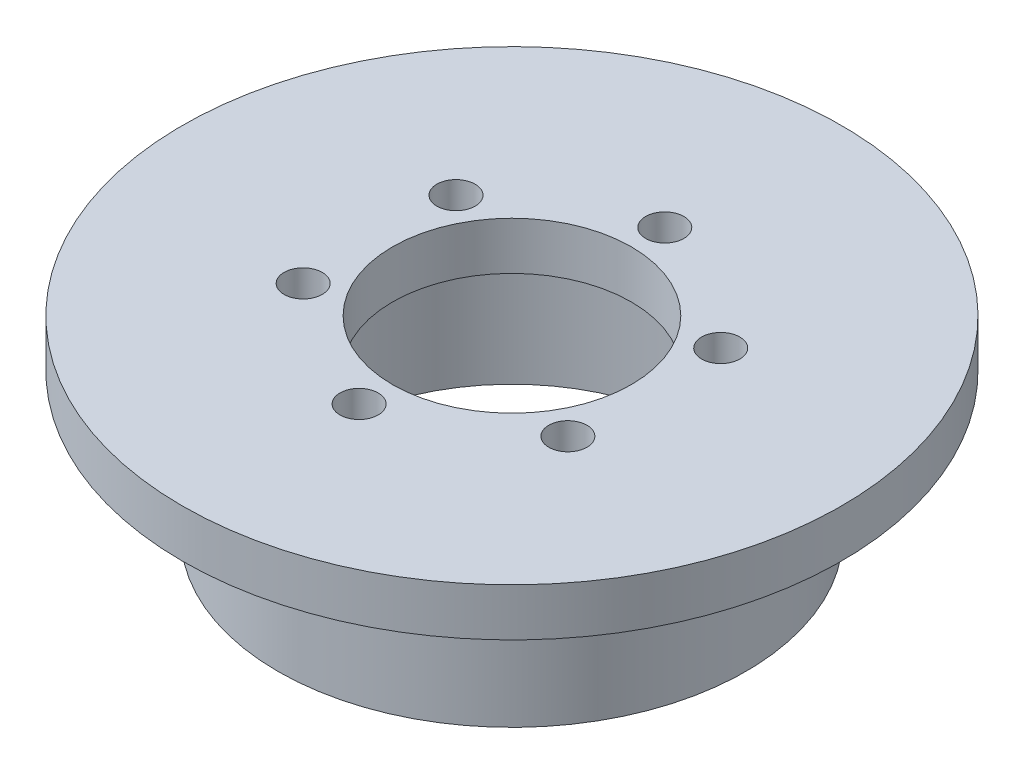
ISO-10303-21;
HEADER;
FILE_DESCRIPTION(('STEP AP214'),'2;1');
FILE_NAME('part.step','',(''),(''),'','','');
FILE_SCHEMA(('AUTOMOTIVE_DESIGN { 1 0 10303 214 1 1 1 1 }'));
ENDSEC;
DATA;
#1=APPLICATION_CONTEXT('core data for automotive mechanical design processes');
#2=APPLICATION_PROTOCOL_DEFINITION('international standard','automotive_design',2000,#1);
#3=PRODUCT_CONTEXT('',#1,'mechanical');
#4=PRODUCT('Part','Part','',(#3));
#5=PRODUCT_RELATED_PRODUCT_CATEGORY('part','',(#4));
#6=PRODUCT_DEFINITION_FORMATION('','',#4);
#7=PRODUCT_DEFINITION_CONTEXT('part definition',#1,'design');
#8=PRODUCT_DEFINITION('design','',#6,#7);
#9=PRODUCT_DEFINITION_SHAPE('','',#8);
#10=(LENGTH_UNIT() NAMED_UNIT(*) SI_UNIT(.MILLI.,.METRE.));
#11=(NAMED_UNIT(*) PLANE_ANGLE_UNIT() SI_UNIT($,.RADIAN.));
#12=(NAMED_UNIT(*) SI_UNIT($,.STERADIAN.) SOLID_ANGLE_UNIT());
#13=UNCERTAINTY_MEASURE_WITH_UNIT(LENGTH_MEASURE(1.E-05),#10,'distance_accuracy_value','');
#14=(GEOMETRIC_REPRESENTATION_CONTEXT(3) GLOBAL_UNCERTAINTY_ASSIGNED_CONTEXT((#13)) GLOBAL_UNIT_ASSIGNED_CONTEXT((#10,
#11,#12)) REPRESENTATION_CONTEXT('',''));
#15=CARTESIAN_POINT('',(0.,0.,0.));
#16=DIRECTION('',(0.,0.,1.));
#17=DIRECTION('',(1.,0.,0.));
#18=AXIS2_PLACEMENT_3D('',#15,#16,#17);
#19=CARTESIAN_POINT('',(0.,5.,0.));
#20=DIRECTION('',(0.,-1.,0.));
#21=DIRECTION('',(0.,0.,-1.));
#22=AXIS2_PLACEMENT_3D('',#19,#20,#21);
#23=CYLINDRICAL_SURFACE('',#22,34.5);
#24=CARTESIAN_POINT('',(0.,5.,0.));
#25=DIRECTION('',(0.,1.,0.));
#26=DIRECTION('',(0.,0.,1.));
#27=AXIS2_PLACEMENT_3D('',#24,#25,#26);
#28=CIRCLE('',#27,34.5);
#29=CARTESIAN_POINT('',(0.,5.,34.5));
#30=VERTEX_POINT('',#29);
#31=EDGE_CURVE('E40',#30,#30,#28,.T.);
#32=ORIENTED_EDGE('',*,*,#31,.F.);
#33=EDGE_LOOP('',(#32));
#34=FACE_BOUND('',#33,.T.);
#35=CARTESIAN_POINT('',(0.,0.,0.));
#36=DIRECTION('',(0.,1.,0.));
#37=DIRECTION('',(0.,0.,1.));
#38=AXIS2_PLACEMENT_3D('',#35,#36,#37);
#39=CIRCLE('',#38,34.5);
#40=CARTESIAN_POINT('',(0.,0.,34.5));
#41=VERTEX_POINT('',#40);
#42=EDGE_CURVE('E44',#41,#41,#39,.T.);
#43=ORIENTED_EDGE('',*,*,#42,.T.);
#44=EDGE_LOOP('',(#43));
#45=FACE_BOUND('',#44,.T.);
#46=ADVANCED_FACE('F34',(#34,#45),#23,.T.);
#47=CARTESIAN_POINT('',(0.,5.,0.));
#48=DIRECTION('',(0.,1.,0.));
#49=DIRECTION('',(0.,0.,1.));
#50=AXIS2_PLACEMENT_3D('',#47,#48,#49);
#51=PLANE('',#50);
#52=CARTESIAN_POINT('',(13.8564064605509,5.,-8.00000000000016));
#53=DIRECTION('',(0.,-1.,0.));
#54=DIRECTION('',(0.866025403784433,0.,-0.50000000000001));
#55=AXIS2_PLACEMENT_3D('',#52,#53,#54);
#56=CIRCLE('',#55,2.);
#57=CARTESIAN_POINT('',(15.5884572681198,5.,-9.00000000000018));
#58=VERTEX_POINT('',#57);
#59=EDGE_CURVE('E81',#58,#58,#56,.T.);
#60=ORIENTED_EDGE('',*,*,#59,.T.);
#61=EDGE_LOOP('',(#60));
#62=FACE_BOUND('',#61,.T.);
#63=CARTESIAN_POINT('',(13.8564064605511,5.,7.99999999999987));
#64=DIRECTION('',(0.,-1.,0.));
#65=DIRECTION('',(0.866025403784443,0.,0.499999999999992));
#66=AXIS2_PLACEMENT_3D('',#63,#64,#65);
#67=CIRCLE('',#66,2.);
#68=CARTESIAN_POINT('',(15.58845726812,5.,8.99999999999986));
#69=VERTEX_POINT('',#68);
#70=EDGE_CURVE('E87',#69,#69,#67,.T.);
#71=ORIENTED_EDGE('',*,*,#70,.T.);
#72=EDGE_LOOP('',(#71));
#73=FACE_BOUND('',#72,.T.);
#74=CARTESIAN_POINT('',(0.,5.,16.));
#75=DIRECTION('',(0.,-1.,0.));
#76=DIRECTION('',(0.,0.,1.));
#77=AXIS2_PLACEMENT_3D('',#74,#75,#76);
#78=CIRCLE('',#77,2.);
#79=CARTESIAN_POINT('',(0.,5.,18.));
#80=VERTEX_POINT('',#79);
#81=EDGE_CURVE('E93',#80,#80,#78,.T.);
#82=ORIENTED_EDGE('',*,*,#81,.T.);
#83=EDGE_LOOP('',(#82));
#84=FACE_BOUND('',#83,.T.);
#85=CARTESIAN_POINT('',(-13.856406460551,5.,8.00000000000007));
#86=DIRECTION('',(0.,-1.,0.));
#87=DIRECTION('',(-0.866025403784436,0.,0.500000000000004));
#88=AXIS2_PLACEMENT_3D('',#85,#86,#87);
#89=CIRCLE('',#88,2.);
#90=CARTESIAN_POINT('',(-15.5884572681199,5.,9.00000000000007));
#91=VERTEX_POINT('',#90);
#92=EDGE_CURVE('E75',#91,#91,#89,.T.);
#93=ORIENTED_EDGE('',*,*,#92,.T.);
#94=EDGE_LOOP('',(#93));
#95=FACE_BOUND('',#94,.T.);
#96=CARTESIAN_POINT('',(-13.856406460551,5.,-7.99999999999997));
#97=DIRECTION('',(0.,-1.,0.));
#98=DIRECTION('',(-0.86602540378444,0.,-0.499999999999998));
#99=AXIS2_PLACEMENT_3D('',#96,#97,#98);
#100=CIRCLE('',#99,2.);
#101=CARTESIAN_POINT('',(-15.5884572681199,5.,-8.99999999999996));
#102=VERTEX_POINT('',#101);
#103=EDGE_CURVE('E69',#102,#102,#100,.T.);
#104=ORIENTED_EDGE('',*,*,#103,.T.);
#105=EDGE_LOOP('',(#104));
#106=FACE_BOUND('',#105,.T.);
#107=CARTESIAN_POINT('',(0.,5.,-16.));
#108=DIRECTION('',(0.,-1.,0.));
#109=DIRECTION('',(0.,0.,-1.));
#110=AXIS2_PLACEMENT_3D('',#107,#108,#109);
#111=CIRCLE('',#110,2.);
#112=CARTESIAN_POINT('',(0.,5.,-18.));
#113=VERTEX_POINT('',#112);
#114=EDGE_CURVE('E63',#113,#113,#111,.T.);
#115=ORIENTED_EDGE('',*,*,#114,.T.);
#116=EDGE_LOOP('',(#115));
#117=FACE_BOUND('',#116,.T.);
#118=CARTESIAN_POINT('',(0.,5.,0.));
#119=DIRECTION('',(0.,-1.,0.));
#120=DIRECTION('',(0.,0.,-1.));
#121=AXIS2_PLACEMENT_3D('',#118,#119,#120);
#122=CIRCLE('',#121,12.5);
#123=CARTESIAN_POINT('',(0.,5.,-12.5));
#124=VERTEX_POINT('',#123);
#125=EDGE_CURVE('E57',#124,#124,#122,.T.);
#126=ORIENTED_EDGE('',*,*,#125,.T.);
#127=EDGE_LOOP('',(#126));
#128=FACE_BOUND('',#127,.T.);
#129=ORIENTED_EDGE('',*,*,#31,.T.);
#130=EDGE_LOOP('',(#129));
#131=FACE_BOUND('',#130,.T.);
#132=ADVANCED_FACE('F102',(#62,#73,#84,#95,#106,#117,#128,#131),#51,.T.);
#133=CARTESIAN_POINT('',(0.,0.,0.));
#134=DIRECTION('',(0.,1.,0.));
#135=DIRECTION('',(0.,0.,1.));
#136=AXIS2_PLACEMENT_3D('',#133,#134,#135);
#137=PLANE('',#136);
#138=CARTESIAN_POINT('',(0.,0.,0.));
#139=DIRECTION('',(0.,1.,0.));
#140=DIRECTION('',(0.,0.,1.));
#141=AXIS2_PLACEMENT_3D('',#138,#139,#140);
#142=CIRCLE('',#141,24.5);
#143=CARTESIAN_POINT('',(0.,0.,24.5));
#144=VERTEX_POINT('',#143);
#145=EDGE_CURVE('E10',#144,#144,#142,.F.);
#146=ORIENTED_EDGE('',*,*,#145,.F.);
#147=EDGE_LOOP('',(#146));
#148=FACE_BOUND('',#147,.T.);
#149=ORIENTED_EDGE('',*,*,#42,.F.);
#150=EDGE_LOOP('',(#149));
#151=FACE_BOUND('',#150,.T.);
#152=ADVANCED_FACE('F119',(#148,#151),#137,.F.);
#153=CARTESIAN_POINT('',(0.,-15.,0.));
#154=DIRECTION('',(0.,-1.,0.));
#155=DIRECTION('',(0.,0.,-1.));
#156=AXIS2_PLACEMENT_3D('',#153,#154,#155);
#157=PLANE('',#156);
#158=CARTESIAN_POINT('',(0.,-15.,0.));
#159=DIRECTION('',(0.,-1.,0.));
#160=DIRECTION('',(0.,0.,-1.));
#161=AXIS2_PLACEMENT_3D('',#158,#159,#160);
#162=CIRCLE('',#161,24.5);
#163=CARTESIAN_POINT('',(0.,-15.,-24.5));
#164=VERTEX_POINT('',#163);
#165=EDGE_CURVE('E49',#164,#164,#162,.T.);
#166=ORIENTED_EDGE('',*,*,#165,.T.);
#167=EDGE_LOOP('',(#166));
#168=FACE_BOUND('',#167,.T.);
#169=CARTESIAN_POINT('',(0.,-15.,0.));
#170=DIRECTION('',(0.,-1.,0.));
#171=DIRECTION('',(0.,0.,-1.));
#172=AXIS2_PLACEMENT_3D('',#169,#170,#171);
#173=CIRCLE('',#172,19.5);
#174=CARTESIAN_POINT('',(0.,-15.,-19.5));
#175=VERTEX_POINT('',#174);
#176=EDGE_CURVE('E53',#175,#175,#173,.T.);
#177=ORIENTED_EDGE('',*,*,#176,.F.);
#178=EDGE_LOOP('',(#177));
#179=FACE_BOUND('',#178,.T.);
#180=ADVANCED_FACE('F135',(#168,#179),#157,.T.);
#181=CARTESIAN_POINT('',(0.,-15.,0.));
#182=DIRECTION('',(0.,1.,0.));
#183=DIRECTION('',(0.,0.,1.));
#184=AXIS2_PLACEMENT_3D('',#181,#182,#183);
#185=CYLINDRICAL_SURFACE('',#184,24.5);
#186=ORIENTED_EDGE('',*,*,#165,.F.);
#187=EDGE_LOOP('',(#186));
#188=FACE_BOUND('',#187,.T.);
#189=ORIENTED_EDGE('',*,*,#145,.T.);
#190=EDGE_LOOP('',(#189));
#191=FACE_BOUND('',#190,.T.);
#192=ADVANCED_FACE('F129',(#188,#191),#185,.T.);
#193=CARTESIAN_POINT('',(0.,-15.,0.));
#194=DIRECTION('',(0.,1.,0.));
#195=DIRECTION('',(0.,0.,1.));
#196=AXIS2_PLACEMENT_3D('',#193,#194,#195);
#197=CYLINDRICAL_SURFACE('',#196,19.5);
#198=ORIENTED_EDGE('',*,*,#176,.T.);
#199=EDGE_LOOP('',(#198));
#200=FACE_BOUND('',#199,.T.);
#201=CARTESIAN_POINT('',(0.,0.,0.));
#202=DIRECTION('',(0.,-1.,0.));
#203=DIRECTION('',(0.,0.,-1.));
#204=AXIS2_PLACEMENT_3D('',#201,#202,#203);
#205=CIRCLE('',#204,19.5);
#206=CARTESIAN_POINT('',(0.,0.,-19.5));
#207=VERTEX_POINT('',#206);
#208=EDGE_CURVE('E54',#207,#207,#205,.T.);
#209=ORIENTED_EDGE('',*,*,#208,.F.);
#210=EDGE_LOOP('',(#209));
#211=FACE_BOUND('',#210,.T.);
#212=ADVANCED_FACE('F117',(#200,#211),#197,.F.);
#213=CARTESIAN_POINT('',(13.8564064605509,0.,-8.00000000000016));
#214=DIRECTION('',(0.,-1.,0.));
#215=DIRECTION('',(0.866025403784433,0.,-0.50000000000001));
#216=AXIS2_PLACEMENT_3D('',#213,#214,#215);
#217=CIRCLE('',#216,2.);
#218=CARTESIAN_POINT('',(15.5884572681198,0.,-9.00000000000018));
#219=VERTEX_POINT('',#218);
#220=EDGE_CURVE('E78',#219,#219,#217,.T.);
#221=ORIENTED_EDGE('',*,*,#220,.F.);
#222=EDGE_LOOP('',(#221));
#223=FACE_BOUND('',#222,.T.);
#224=CARTESIAN_POINT('',(13.8564064605511,0.,7.99999999999987));
#225=DIRECTION('',(0.,-1.,0.));
#226=DIRECTION('',(0.866025403784443,0.,0.499999999999992));
#227=AXIS2_PLACEMENT_3D('',#224,#225,#226);
#228=CIRCLE('',#227,2.);
#229=CARTESIAN_POINT('',(15.58845726812,0.,8.99999999999986));
#230=VERTEX_POINT('',#229);
#231=EDGE_CURVE('E84',#230,#230,#228,.T.);
#232=ORIENTED_EDGE('',*,*,#231,.F.);
#233=EDGE_LOOP('',(#232));
#234=FACE_BOUND('',#233,.T.);
#235=CARTESIAN_POINT('',(0.,0.,16.));
#236=DIRECTION('',(0.,-1.,0.));
#237=DIRECTION('',(0.,0.,1.));
#238=AXIS2_PLACEMENT_3D('',#235,#236,#237);
#239=CIRCLE('',#238,2.);
#240=CARTESIAN_POINT('',(0.,0.,18.));
#241=VERTEX_POINT('',#240);
#242=EDGE_CURVE('E90',#241,#241,#239,.T.);
#243=ORIENTED_EDGE('',*,*,#242,.F.);
#244=EDGE_LOOP('',(#243));
#245=FACE_BOUND('',#244,.T.);
#246=CARTESIAN_POINT('',(-13.856406460551,0.,8.00000000000007));
#247=DIRECTION('',(0.,-1.,0.));
#248=DIRECTION('',(-0.866025403784436,0.,0.500000000000004));
#249=AXIS2_PLACEMENT_3D('',#246,#247,#248);
#250=CIRCLE('',#249,2.);
#251=CARTESIAN_POINT('',(-15.5884572681199,0.,9.00000000000007));
#252=VERTEX_POINT('',#251);
#253=EDGE_CURVE('E96',#252,#252,#250,.T.);
#254=ORIENTED_EDGE('',*,*,#253,.F.);
#255=EDGE_LOOP('',(#254));
#256=FACE_BOUND('',#255,.T.);
#257=CARTESIAN_POINT('',(-13.856406460551,0.,-7.99999999999997));
#258=DIRECTION('',(0.,-1.,0.));
#259=DIRECTION('',(-0.86602540378444,0.,-0.499999999999998));
#260=AXIS2_PLACEMENT_3D('',#257,#258,#259);
#261=CIRCLE('',#260,2.);
#262=CARTESIAN_POINT('',(-15.5884572681199,0.,-8.99999999999996));
#263=VERTEX_POINT('',#262);
#264=EDGE_CURVE('E72',#263,#263,#261,.T.);
#265=ORIENTED_EDGE('',*,*,#264,.F.);
#266=EDGE_LOOP('',(#265));
#267=FACE_BOUND('',#266,.T.);
#268=CARTESIAN_POINT('',(0.,0.,-16.));
#269=DIRECTION('',(0.,-1.,0.));
#270=DIRECTION('',(0.,0.,-1.));
#271=AXIS2_PLACEMENT_3D('',#268,#269,#270);
#272=CIRCLE('',#271,2.);
#273=CARTESIAN_POINT('',(0.,0.,-18.));
#274=VERTEX_POINT('',#273);
#275=EDGE_CURVE('E66',#274,#274,#272,.T.);
#276=ORIENTED_EDGE('',*,*,#275,.F.);
#277=EDGE_LOOP('',(#276));
#278=FACE_BOUND('',#277,.T.);
#279=CARTESIAN_POINT('',(0.,0.,0.));
#280=DIRECTION('',(0.,-1.,0.));
#281=DIRECTION('',(0.,0.,-1.));
#282=AXIS2_PLACEMENT_3D('',#279,#280,#281);
#283=CIRCLE('',#282,12.5);
#284=CARTESIAN_POINT('',(0.,0.,-12.5));
#285=VERTEX_POINT('',#284);
#286=EDGE_CURVE('E60',#285,#285,#283,.T.);
#287=ORIENTED_EDGE('',*,*,#286,.F.);
#288=EDGE_LOOP('',(#287));
#289=FACE_BOUND('',#288,.T.);
#290=ORIENTED_EDGE('',*,*,#208,.T.);
#291=EDGE_LOOP('',(#290));
#292=FACE_BOUND('',#291,.T.);
#293=ADVANCED_FACE('F113',(#223,#234,#245,#256,#267,#278,#289,#292),#137,.F.);
#294=CARTESIAN_POINT('',(0.,5.,0.));
#295=DIRECTION('',(0.,-1.,0.));
#296=DIRECTION('',(0.,0.,-1.));
#297=AXIS2_PLACEMENT_3D('',#294,#295,#296);
#298=CYLINDRICAL_SURFACE('',#297,12.5);
#299=ORIENTED_EDGE('',*,*,#125,.F.);
#300=EDGE_LOOP('',(#299));
#301=FACE_BOUND('',#300,.T.);
#302=ORIENTED_EDGE('',*,*,#286,.T.);
#303=EDGE_LOOP('',(#302));
#304=FACE_BOUND('',#303,.T.);
#305=ADVANCED_FACE('F116',(#301,#304),#298,.F.);
#306=CARTESIAN_POINT('',(0.,5.,-16.));
#307=DIRECTION('',(0.,-1.,0.));
#308=DIRECTION('',(0.,0.,-1.));
#309=AXIS2_PLACEMENT_3D('',#306,#307,#308);
#310=CYLINDRICAL_SURFACE('',#309,2.);
#311=ORIENTED_EDGE('',*,*,#114,.F.);
#312=EDGE_LOOP('',(#311));
#313=FACE_BOUND('',#312,.T.);
#314=ORIENTED_EDGE('',*,*,#275,.T.);
#315=EDGE_LOOP('',(#314));
#316=FACE_BOUND('',#315,.T.);
#317=ADVANCED_FACE('F180',(#313,#316),#310,.F.);
#318=CARTESIAN_POINT('',(-13.856406460551,5.,-7.99999999999997));
#319=DIRECTION('',(0.,-1.,0.));
#320=DIRECTION('',(0.,0.,-1.));
#321=AXIS2_PLACEMENT_3D('',#318,#319,#320);
#322=CYLINDRICAL_SURFACE('',#321,2.);
#323=ORIENTED_EDGE('',*,*,#103,.F.);
#324=EDGE_LOOP('',(#323));
#325=FACE_BOUND('',#324,.T.);
#326=ORIENTED_EDGE('',*,*,#264,.T.);
#327=EDGE_LOOP('',(#326));
#328=FACE_BOUND('',#327,.T.);
#329=ADVANCED_FACE('F109',(#325,#328),#322,.F.);
#330=CARTESIAN_POINT('',(-13.856406460551,5.,8.00000000000007));
#331=DIRECTION('',(0.,-1.,0.));
#332=DIRECTION('',(0.,0.,-1.));
#333=AXIS2_PLACEMENT_3D('',#330,#331,#332);
#334=CYLINDRICAL_SURFACE('',#333,2.);
#335=ORIENTED_EDGE('',*,*,#92,.F.);
#336=EDGE_LOOP('',(#335));
#337=FACE_BOUND('',#336,.T.);
#338=ORIENTED_EDGE('',*,*,#253,.T.);
#339=EDGE_LOOP('',(#338));
#340=FACE_BOUND('',#339,.T.);
#341=ADVANCED_FACE('F105',(#337,#340),#334,.F.);
#342=CARTESIAN_POINT('',(0.,5.,16.));
#343=DIRECTION('',(0.,-1.,0.));
#344=DIRECTION('',(0.,0.,-1.));
#345=AXIS2_PLACEMENT_3D('',#342,#343,#344);
#346=CYLINDRICAL_SURFACE('',#345,2.);
#347=ORIENTED_EDGE('',*,*,#81,.F.);
#348=EDGE_LOOP('',(#347));
#349=FACE_BOUND('',#348,.T.);
#350=ORIENTED_EDGE('',*,*,#242,.T.);
#351=EDGE_LOOP('',(#350));
#352=FACE_BOUND('',#351,.T.);
#353=ADVANCED_FACE('F108',(#349,#352),#346,.F.);
#354=CARTESIAN_POINT('',(13.8564064605511,5.,7.99999999999987));
#355=DIRECTION('',(0.,-1.,0.));
#356=DIRECTION('',(0.,0.,-1.));
#357=AXIS2_PLACEMENT_3D('',#354,#355,#356);
#358=CYLINDRICAL_SURFACE('',#357,2.);
#359=ORIENTED_EDGE('',*,*,#70,.F.);
#360=EDGE_LOOP('',(#359));
#361=FACE_BOUND('',#360,.T.);
#362=ORIENTED_EDGE('',*,*,#231,.T.);
#363=EDGE_LOOP('',(#362));
#364=FACE_BOUND('',#363,.T.);
#365=ADVANCED_FACE('F234',(#361,#364),#358,.F.);
#366=CARTESIAN_POINT('',(13.8564064605509,5.,-8.00000000000016));
#367=DIRECTION('',(0.,-1.,0.));
#368=DIRECTION('',(0.,0.,-1.));
#369=AXIS2_PLACEMENT_3D('',#366,#367,#368);
#370=CYLINDRICAL_SURFACE('',#369,2.);
#371=ORIENTED_EDGE('',*,*,#59,.F.);
#372=EDGE_LOOP('',(#371));
#373=FACE_BOUND('',#372,.T.);
#374=ORIENTED_EDGE('',*,*,#220,.T.);
#375=EDGE_LOOP('',(#374));
#376=FACE_BOUND('',#375,.T.);
#377=ADVANCED_FACE('F245',(#373,#376),#370,.F.);
#378=CLOSED_SHELL('',(#46,#132,#152,#180,#192,#212,#293,#305,#317,#329,#341,#353,#365,#377));
#379=MANIFOLD_SOLID_BREP('B2',#378);
#380=ADVANCED_BREP_SHAPE_REPRESENTATION('',(#18,#379),#14);
#381=SHAPE_DEFINITION_REPRESENTATION(#9,#380);
ENDSEC;
END-ISO-10303-21;
